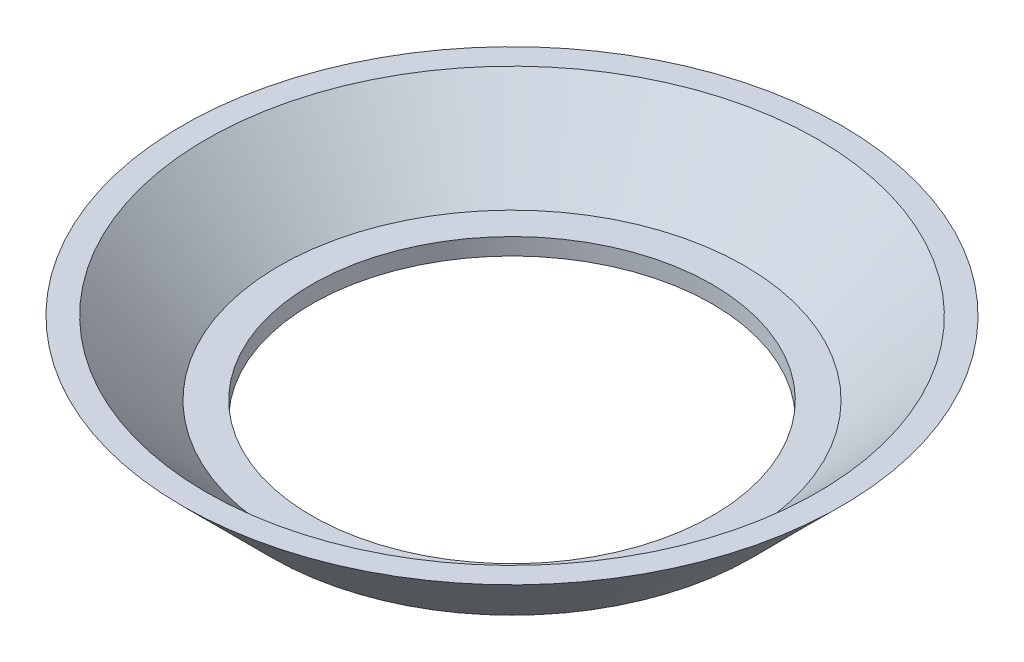
ISO-10303-21;
HEADER;
FILE_DESCRIPTION(('STEP AP214'),'2;1');
FILE_NAME('part.step','',(''),(''),'','','');
FILE_SCHEMA(('AUTOMOTIVE_DESIGN { 1 0 10303 214 1 1 1 1 }'));
ENDSEC;
DATA;
#1=APPLICATION_CONTEXT('core data for automotive mechanical design processes');
#2=APPLICATION_PROTOCOL_DEFINITION('international standard','automotive_design',2000,#1);
#3=PRODUCT_CONTEXT('',#1,'mechanical');
#4=PRODUCT('Part','Part','',(#3));
#5=PRODUCT_RELATED_PRODUCT_CATEGORY('part','',(#4));
#6=PRODUCT_DEFINITION_FORMATION('','',#4);
#7=PRODUCT_DEFINITION_CONTEXT('part definition',#1,'design');
#8=PRODUCT_DEFINITION('design','',#6,#7);
#9=PRODUCT_DEFINITION_SHAPE('','',#8);
#10=(LENGTH_UNIT() NAMED_UNIT(*) SI_UNIT(.MILLI.,.METRE.));
#11=(NAMED_UNIT(*) PLANE_ANGLE_UNIT() SI_UNIT($,.RADIAN.));
#12=(NAMED_UNIT(*) SI_UNIT($,.STERADIAN.) SOLID_ANGLE_UNIT());
#13=UNCERTAINTY_MEASURE_WITH_UNIT(LENGTH_MEASURE(1.E-05),#10,'distance_accuracy_value','');
#14=(GEOMETRIC_REPRESENTATION_CONTEXT(3) GLOBAL_UNCERTAINTY_ASSIGNED_CONTEXT((#13)) GLOBAL_UNIT_ASSIGNED_CONTEXT((#10,
#11,#12)) REPRESENTATION_CONTEXT('',''));
#15=CARTESIAN_POINT('',(0.,0.,0.));
#16=DIRECTION('',(0.,0.,1.));
#17=DIRECTION('',(1.,0.,0.));
#18=AXIS2_PLACEMENT_3D('',#15,#16,#17);
#19=CARTESIAN_POINT('',(0.,-7.79856313926075,0.));
#20=DIRECTION('',(0.,-1.,0.));
#21=DIRECTION('',(0.,0.,-1.));
#22=AXIS2_PLACEMENT_3D('',#19,#20,#21);
#23=CYLINDRICAL_SURFACE('',#22,35.66);
#24=CARTESIAN_POINT('',(0.,0.,0.));
#25=DIRECTION('',(0.,-1.,0.));
#26=DIRECTION('',(0.,0.,-1.));
#27=AXIS2_PLACEMENT_3D('',#24,#25,#26);
#28=CIRCLE('',#27,35.66);
#29=CARTESIAN_POINT('',(0.,0.,-35.66));
#30=VERTEX_POINT('',#29);
#31=EDGE_CURVE('E10',#30,#30,#28,.T.);
#32=ORIENTED_EDGE('',*,*,#31,.T.);
#33=EDGE_LOOP('',(#32));
#34=FACE_BOUND('',#33,.T.);
#35=CARTESIAN_POINT('',(0.,3.,0.));
#36=DIRECTION('',(0.,-1.,0.));
#37=DIRECTION('',(0.,0.,-1.));
#38=AXIS2_PLACEMENT_3D('',#35,#36,#37);
#39=CIRCLE('',#38,35.66);
#40=CARTESIAN_POINT('',(0.,3.,-35.66));
#41=VERTEX_POINT('',#40);
#42=EDGE_CURVE('E70',#41,#41,#39,.T.);
#43=ORIENTED_EDGE('',*,*,#42,.F.);
#44=EDGE_LOOP('',(#43));
#45=FACE_BOUND('',#44,.T.);
#46=ADVANCED_FACE('F43',(#34,#45),#23,.F.);
#47=CARTESIAN_POINT('',(35.66,0.,0.));
#48=DIRECTION('',(0.,-1.,0.));
#49=DIRECTION('',(0.,0.,-1.));
#50=AXIS2_PLACEMENT_3D('',#47,#48,#49);
#51=PLANE('',#50);
#52=CARTESIAN_POINT('',(0.,0.,0.));
#53=DIRECTION('',(0.,-1.,0.));
#54=DIRECTION('',(0.,0.,-1.));
#55=AXIS2_PLACEMENT_3D('',#52,#53,#54);
#56=CIRCLE('',#55,42.66);
#57=CARTESIAN_POINT('',(0.,0.,-42.66));
#58=VERTEX_POINT('',#57);
#59=EDGE_CURVE('E50',#58,#58,#56,.T.);
#60=ORIENTED_EDGE('',*,*,#59,.T.);
#61=EDGE_LOOP('',(#60));
#62=FACE_BOUND('',#61,.T.);
#63=ORIENTED_EDGE('',*,*,#31,.F.);
#64=EDGE_LOOP('',(#63));
#65=FACE_BOUND('',#64,.T.);
#66=ADVANCED_FACE('F79',(#62,#65),#51,.T.);
#67=CARTESIAN_POINT('',(0.,0.,0.));
#68=DIRECTION('',(0.,1.,0.));
#69=DIRECTION('',(0.,0.,1.));
#70=AXIS2_PLACEMENT_3D('',#67,#68,#69);
#71=CONICAL_SURFACE('',#70,42.66,0.785398163397448);
#72=CARTESIAN_POINT('',(0.,16.,0.));
#73=DIRECTION('',(0.,-1.,0.));
#74=DIRECTION('',(0.,0.,-1.));
#75=AXIS2_PLACEMENT_3D('',#72,#73,#74);
#76=CIRCLE('',#75,58.66);
#77=CARTESIAN_POINT('',(0.,16.,-58.66));
#78=VERTEX_POINT('',#77);
#79=EDGE_CURVE('E55',#78,#78,#76,.T.);
#80=ORIENTED_EDGE('',*,*,#79,.T.);
#81=EDGE_LOOP('',(#80));
#82=FACE_BOUND('',#81,.T.);
#83=ORIENTED_EDGE('',*,*,#59,.F.);
#84=EDGE_LOOP('',(#83));
#85=FACE_BOUND('',#84,.T.);
#86=ADVANCED_FACE('F83',(#82,#85),#71,.T.);
#87=CARTESIAN_POINT('',(58.66,16.,0.));
#88=DIRECTION('',(0.,1.,0.));
#89=DIRECTION('',(0.,0.,1.));
#90=AXIS2_PLACEMENT_3D('',#87,#88,#89);
#91=PLANE('',#90);
#92=CARTESIAN_POINT('',(0.,16.,0.));
#93=DIRECTION('',(0.,-1.,0.));
#94=DIRECTION('',(0.,0.,-1.));
#95=AXIS2_PLACEMENT_3D('',#92,#93,#94);
#96=CIRCLE('',#95,54.4173593128807);
#97=CARTESIAN_POINT('',(0.,16.,-54.4173593128807));
#98=VERTEX_POINT('',#97);
#99=EDGE_CURVE('E60',#98,#98,#96,.T.);
#100=ORIENTED_EDGE('',*,*,#99,.T.);
#101=EDGE_LOOP('',(#100));
#102=FACE_BOUND('',#101,.T.);
#103=ORIENTED_EDGE('',*,*,#79,.F.);
#104=EDGE_LOOP('',(#103));
#105=FACE_BOUND('',#104,.T.);
#106=ADVANCED_FACE('F87',(#102,#105),#91,.T.);
#107=CARTESIAN_POINT('',(0.,16.,0.));
#108=DIRECTION('',(0.,1.,0.));
#109=DIRECTION('',(0.,0.,1.));
#110=AXIS2_PLACEMENT_3D('',#107,#108,#109);
#111=CONICAL_SURFACE('',#110,54.4173593128807,0.785398163397448);
#112=CARTESIAN_POINT('',(0.,3.,0.));
#113=DIRECTION('',(0.,-1.,0.));
#114=DIRECTION('',(0.,0.,-1.));
#115=AXIS2_PLACEMENT_3D('',#112,#113,#114);
#116=CIRCLE('',#115,41.4173593128807);
#117=CARTESIAN_POINT('',(0.,3.,-41.4173593128807));
#118=VERTEX_POINT('',#117);
#119=EDGE_CURVE('E66',#118,#118,#116,.T.);
#120=ORIENTED_EDGE('',*,*,#119,.T.);
#121=EDGE_LOOP('',(#120));
#122=FACE_BOUND('',#121,.T.);
#123=ORIENTED_EDGE('',*,*,#99,.F.);
#124=EDGE_LOOP('',(#123));
#125=FACE_BOUND('',#124,.T.);
#126=ADVANCED_FACE('F94',(#122,#125),#111,.F.);
#127=CARTESIAN_POINT('',(41.4173593128807,3.,0.));
#128=DIRECTION('',(0.,1.,0.));
#129=DIRECTION('',(0.,0.,1.));
#130=AXIS2_PLACEMENT_3D('',#127,#128,#129);
#131=PLANE('',#130);
#132=ORIENTED_EDGE('',*,*,#42,.T.);
#133=EDGE_LOOP('',(#132));
#134=FACE_BOUND('',#133,.T.);
#135=ORIENTED_EDGE('',*,*,#119,.F.);
#136=EDGE_LOOP('',(#135));
#137=FACE_BOUND('',#136,.T.);
#138=ADVANCED_FACE('F75',(#134,#137),#131,.T.);
#139=CLOSED_SHELL('',(#46,#66,#86,#106,#126,#138));
#140=MANIFOLD_SOLID_BREP('B2',#139);
#141=ADVANCED_BREP_SHAPE_REPRESENTATION('',(#18,#140),#14);
#142=SHAPE_DEFINITION_REPRESENTATION(#9,#141);
ENDSEC;
END-ISO-10303-21;
